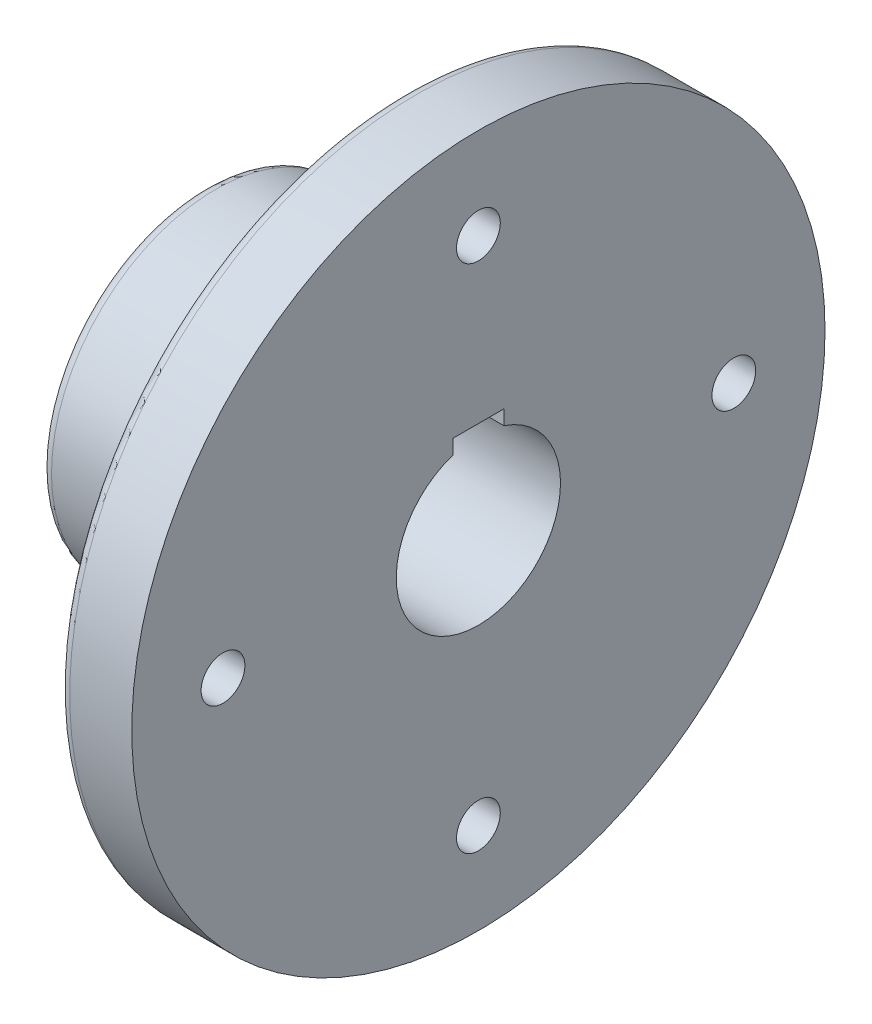
ISO-10303-21;
HEADER;
FILE_DESCRIPTION(('STEP AP214'),'2;1');
FILE_NAME('part.step','',(''),(''),'','','');
FILE_SCHEMA(('AUTOMOTIVE_DESIGN { 1 0 10303 214 1 1 1 1 }'));
ENDSEC;
DATA;
#1=APPLICATION_CONTEXT('core data for automotive mechanical design processes');
#2=APPLICATION_PROTOCOL_DEFINITION('international standard','automotive_design',2000,#1);
#3=PRODUCT_CONTEXT('',#1,'mechanical');
#4=PRODUCT('Part','Part','',(#3));
#5=PRODUCT_RELATED_PRODUCT_CATEGORY('part','',(#4));
#6=PRODUCT_DEFINITION_FORMATION('','',#4);
#7=PRODUCT_DEFINITION_CONTEXT('part definition',#1,'design');
#8=PRODUCT_DEFINITION('design','',#6,#7);
#9=PRODUCT_DEFINITION_SHAPE('','',#8);
#10=(LENGTH_UNIT() NAMED_UNIT(*) SI_UNIT(.MILLI.,.METRE.));
#11=(NAMED_UNIT(*) PLANE_ANGLE_UNIT() SI_UNIT($,.RADIAN.));
#12=(NAMED_UNIT(*) SI_UNIT($,.STERADIAN.) SOLID_ANGLE_UNIT());
#13=UNCERTAINTY_MEASURE_WITH_UNIT(LENGTH_MEASURE(1.E-05),#10,'distance_accuracy_value','');
#14=(GEOMETRIC_REPRESENTATION_CONTEXT(3) GLOBAL_UNCERTAINTY_ASSIGNED_CONTEXT((#13)) GLOBAL_UNIT_ASSIGNED_CONTEXT((#10,
#11,#12)) REPRESENTATION_CONTEXT('',''));
#15=CARTESIAN_POINT('',(0.,0.,0.));
#16=DIRECTION('',(0.,0.,1.));
#17=DIRECTION('',(1.,0.,0.));
#18=AXIS2_PLACEMENT_3D('',#15,#16,#17);
#19=CARTESIAN_POINT('',(-20.,0.,0.));
#20=DIRECTION('',(1.,0.,0.));
#21=DIRECTION('',(0.,0.,-1.));
#22=AXIS2_PLACEMENT_3D('',#19,#20,#21);
#23=CYLINDRICAL_SURFACE('',#22,95.);
#24=CARTESIAN_POINT('',(-17.,0.,0.));
#25=DIRECTION('',(1.,0.,0.));
#26=DIRECTION('',(0.,0.,-1.));
#27=AXIS2_PLACEMENT_3D('',#24,#25,#26);
#28=CIRCLE('',#27,95.);
#29=CARTESIAN_POINT('',(-17.,0.,-95.));
#30=VERTEX_POINT('',#29);
#31=EDGE_CURVE('E11',#30,#30,#28,.T.);
#32=ORIENTED_EDGE('',*,*,#31,.T.);
#33=EDGE_LOOP('',(#32));
#34=FACE_BOUND('',#33,.T.);
#35=CARTESIAN_POINT('',(0.,0.,0.));
#36=DIRECTION('',(1.,0.,0.));
#37=DIRECTION('',(0.,0.,-1.));
#38=AXIS2_PLACEMENT_3D('',#35,#36,#37);
#39=CIRCLE('',#38,95.);
#40=CARTESIAN_POINT('',(0.,0.,-95.));
#41=VERTEX_POINT('',#40);
#42=EDGE_CURVE('E167',#41,#41,#39,.T.);
#43=ORIENTED_EDGE('',*,*,#42,.F.);
#44=EDGE_LOOP('',(#43));
#45=FACE_BOUND('',#44,.T.);
#46=ADVANCED_FACE('F45',(#34,#45),#23,.T.);
#47=CARTESIAN_POINT('',(-20.,0.,0.));
#48=DIRECTION('',(1.,0.,0.));
#49=DIRECTION('',(0.,0.,-1.));
#50=AXIS2_PLACEMENT_3D('',#47,#48,#49);
#51=PLANE('',#50);
#52=CARTESIAN_POINT('',(-20.,0.,0.));
#53=DIRECTION('',(1.,0.,0.));
#54=DIRECTION('',(0.,0.,-1.));
#55=AXIS2_PLACEMENT_3D('',#52,#53,#54);
#56=CIRCLE('',#55,48.);
#57=CARTESIAN_POINT('',(-20.,0.,-48.));
#58=VERTEX_POINT('',#57);
#59=EDGE_CURVE('E54',#58,#58,#56,.T.);
#60=ORIENTED_EDGE('',*,*,#59,.T.);
#61=EDGE_LOOP('',(#60));
#62=FACE_BOUND('',#61,.T.);
#63=CARTESIAN_POINT('',(-20.,0.,0.));
#64=DIRECTION('',(1.,0.,0.));
#65=DIRECTION('',(0.,0.,-1.));
#66=AXIS2_PLACEMENT_3D('',#63,#64,#65);
#67=CIRCLE('',#66,92.);
#68=CARTESIAN_POINT('',(-20.,0.,-92.));
#69=VERTEX_POINT('',#68);
#70=EDGE_CURVE('E183',#69,#69,#67,.F.);
#71=ORIENTED_EDGE('',*,*,#70,.T.);
#72=EDGE_LOOP('',(#71));
#73=FACE_BOUND('',#72,.T.);
#74=CARTESIAN_POINT('',(-20.,70.,0.));
#75=DIRECTION('',(1.,0.,0.));
#76=DIRECTION('',(0.,0.,-1.));
#77=AXIS2_PLACEMENT_3D('',#74,#75,#76);
#78=CIRCLE('',#77,6.);
#79=CARTESIAN_POINT('',(-20.,70.,-6.));
#80=VERTEX_POINT('',#79);
#81=EDGE_CURVE('E133',#80,#80,#78,.F.);
#82=ORIENTED_EDGE('',*,*,#81,.F.);
#83=EDGE_LOOP('',(#82));
#84=FACE_BOUND('',#83,.T.);
#85=CARTESIAN_POINT('',(-20.,-2.44403693719019E-13,-70.));
#86=DIRECTION('',(1.,0.,0.));
#87=DIRECTION('',(0.,0.,-1.));
#88=AXIS2_PLACEMENT_3D('',#85,#86,#87);
#89=CIRCLE('',#88,6.00000000000001);
#90=CARTESIAN_POINT('',(-20.,-2.44403693719019E-13,-76.));
#91=VERTEX_POINT('',#90);
#92=EDGE_CURVE('E139',#91,#91,#89,.F.);
#93=ORIENTED_EDGE('',*,*,#92,.F.);
#94=EDGE_LOOP('',(#93));
#95=FACE_BOUND('',#94,.T.);
#96=CARTESIAN_POINT('',(-20.,-70.,4.88807387438039E-13));
#97=DIRECTION('',(1.,0.,0.));
#98=DIRECTION('',(0.,0.,-1.));
#99=AXIS2_PLACEMENT_3D('',#96,#97,#98);
#100=CIRCLE('',#99,6.);
#101=CARTESIAN_POINT('',(-20.,-70.,-5.99999999999951));
#102=VERTEX_POINT('',#101);
#103=EDGE_CURVE('E147',#102,#102,#100,.F.);
#104=ORIENTED_EDGE('',*,*,#103,.F.);
#105=EDGE_LOOP('',(#104));
#106=FACE_BOUND('',#105,.T.);
#107=CARTESIAN_POINT('',(-20.,7.33211081157058E-13,70.));
#108=DIRECTION('',(1.,0.,0.));
#109=DIRECTION('',(0.,0.,-1.));
#110=AXIS2_PLACEMENT_3D('',#107,#108,#109);
#111=CIRCLE('',#110,6.00000000000001);
#112=CARTESIAN_POINT('',(-20.,7.33211081157058E-13,64.));
#113=VERTEX_POINT('',#112);
#114=EDGE_CURVE('E124',#113,#113,#111,.F.);
#115=ORIENTED_EDGE('',*,*,#114,.F.);
#116=EDGE_LOOP('',(#115));
#117=FACE_BOUND('',#116,.T.);
#118=ADVANCED_FACE('F190',(#62,#73,#84,#95,#106,#117),#51,.F.);
#119=CARTESIAN_POINT('',(0.,0.,0.));
#120=DIRECTION('',(1.,0.,0.));
#121=DIRECTION('',(0.,0.,-1.));
#122=AXIS2_PLACEMENT_3D('',#119,#120,#121);
#123=PLANE('',#122);
#124=DIRECTION('',(0.,1.,0.));
#125=VECTOR('',#124,1.);
#126=CARTESIAN_POINT('',(0.,25.3834047803431,-7.));
#127=LINE('',#126,#125);
#128=CARTESIAN_POINT('',(0.,21.3834047803431,-7.));
#129=VERTEX_POINT('',#128);
#130=CARTESIAN_POINT('',(0.,25.3834047803431,-7.));
#131=VERTEX_POINT('',#130);
#132=EDGE_CURVE('E115',#129,#131,#127,.T.);
#133=ORIENTED_EDGE('',*,*,#132,.F.);
#134=CARTESIAN_POINT('',(0.,0.,0.));
#135=DIRECTION('',(1.,0.,0.));
#136=DIRECTION('',(0.,0.,-1.));
#137=AXIS2_PLACEMENT_3D('',#134,#135,#136);
#138=CIRCLE('',#137,22.5);
#139=CARTESIAN_POINT('',(0.,21.3834047803431,6.99999999999999));
#140=VERTEX_POINT('',#139);
#141=EDGE_CURVE('E138',#140,#129,#138,.T.);
#142=ORIENTED_EDGE('',*,*,#141,.F.);
#143=DIRECTION('',(0.,-1.,0.));
#144=VECTOR('',#143,1.);
#145=CARTESIAN_POINT('',(0.,25.3834047803431,7.));
#146=LINE('',#145,#144);
#147=CARTESIAN_POINT('',(0.,25.3834047803431,7.));
#148=VERTEX_POINT('',#147);
#149=EDGE_CURVE('E61',#148,#140,#146,.T.);
#150=ORIENTED_EDGE('',*,*,#149,.F.);
#151=DIRECTION('',(0.,0.,1.));
#152=VECTOR('',#151,1.);
#153=CARTESIAN_POINT('',(0.,25.3834047803431,7.));
#154=LINE('',#153,#152);
#155=EDGE_CURVE('E97',#131,#148,#154,.T.);
#156=ORIENTED_EDGE('',*,*,#155,.F.);
#157=EDGE_LOOP('',(#133,#142,#150,#156));
#158=FACE_BOUND('',#157,.T.);
#159=CARTESIAN_POINT('',(0.,70.,0.));
#160=DIRECTION('',(1.,0.,0.));
#161=DIRECTION('',(0.,0.,-1.));
#162=AXIS2_PLACEMENT_3D('',#159,#160,#161);
#163=CIRCLE('',#162,6.);
#164=CARTESIAN_POINT('',(0.,70.,-6.));
#165=VERTEX_POINT('',#164);
#166=EDGE_CURVE('E129',#165,#165,#163,.T.);
#167=ORIENTED_EDGE('',*,*,#166,.F.);
#168=EDGE_LOOP('',(#167));
#169=FACE_BOUND('',#168,.T.);
#170=CARTESIAN_POINT('',(0.,-2.44403693719019E-13,-70.));
#171=DIRECTION('',(1.,0.,0.));
#172=DIRECTION('',(0.,0.,-1.));
#173=AXIS2_PLACEMENT_3D('',#170,#171,#172);
#174=CIRCLE('',#173,6.00000000000001);
#175=CARTESIAN_POINT('',(0.,-2.44403693719019E-13,-76.));
#176=VERTEX_POINT('',#175);
#177=EDGE_CURVE('E134',#176,#176,#174,.T.);
#178=ORIENTED_EDGE('',*,*,#177,.F.);
#179=EDGE_LOOP('',(#178));
#180=FACE_BOUND('',#179,.T.);
#181=CARTESIAN_POINT('',(0.,-70.,4.88807387438039E-13));
#182=DIRECTION('',(1.,0.,0.));
#183=DIRECTION('',(0.,0.,-1.));
#184=AXIS2_PLACEMENT_3D('',#181,#182,#183);
#185=CIRCLE('',#184,6.);
#186=CARTESIAN_POINT('',(0.,-70.,-5.99999999999951));
#187=VERTEX_POINT('',#186);
#188=EDGE_CURVE('E143',#187,#187,#185,.T.);
#189=ORIENTED_EDGE('',*,*,#188,.F.);
#190=EDGE_LOOP('',(#189));
#191=FACE_BOUND('',#190,.T.);
#192=CARTESIAN_POINT('',(0.,7.33211081157058E-13,70.));
#193=DIRECTION('',(1.,0.,0.));
#194=DIRECTION('',(0.,0.,-1.));
#195=AXIS2_PLACEMENT_3D('',#192,#193,#194);
#196=CIRCLE('',#195,6.00000000000001);
#197=CARTESIAN_POINT('',(0.,7.33211081157058E-13,64.));
#198=VERTEX_POINT('',#197);
#199=EDGE_CURVE('E151',#198,#198,#196,.T.);
#200=ORIENTED_EDGE('',*,*,#199,.F.);
#201=EDGE_LOOP('',(#200));
#202=FACE_BOUND('',#201,.T.);
#203=ORIENTED_EDGE('',*,*,#42,.T.);
#204=EDGE_LOOP('',(#203));
#205=FACE_BOUND('',#204,.T.);
#206=ADVANCED_FACE('F201',(#158,#169,#180,#191,#202,#205),#123,.T.);
#207=CARTESIAN_POINT('',(-75.,0.,0.));
#208=DIRECTION('',(1.,0.,0.));
#209=DIRECTION('',(0.,0.,-1.));
#210=AXIS2_PLACEMENT_3D('',#207,#208,#209);
#211=CYLINDRICAL_SURFACE('',#210,45.);
#212=CARTESIAN_POINT('',(-72.,0.,0.));
#213=DIRECTION('',(-1.,0.,0.));
#214=DIRECTION('',(0.,0.,1.));
#215=AXIS2_PLACEMENT_3D('',#212,#213,#214);
#216=CIRCLE('',#215,45.);
#217=CARTESIAN_POINT('',(-72.,0.,45.));
#218=VERTEX_POINT('',#217);
#219=EDGE_CURVE('E179',#218,#218,#216,.F.);
#220=ORIENTED_EDGE('',*,*,#219,.T.);
#221=EDGE_LOOP('',(#220));
#222=FACE_BOUND('',#221,.T.);
#223=CARTESIAN_POINT('',(-23.,0.,0.));
#224=DIRECTION('',(1.,0.,0.));
#225=DIRECTION('',(0.,0.,-1.));
#226=AXIS2_PLACEMENT_3D('',#223,#224,#225);
#227=CIRCLE('',#226,45.);
#228=CARTESIAN_POINT('',(-23.,0.,-45.));
#229=VERTEX_POINT('',#228);
#230=EDGE_CURVE('E175',#229,#229,#227,.F.);
#231=ORIENTED_EDGE('',*,*,#230,.T.);
#232=EDGE_LOOP('',(#231));
#233=FACE_BOUND('',#232,.T.);
#234=ADVANCED_FACE('F199',(#222,#233),#211,.T.);
#235=CARTESIAN_POINT('',(-75.,0.,0.));
#236=DIRECTION('',(-1.,0.,0.));
#237=DIRECTION('',(0.,0.,1.));
#238=AXIS2_PLACEMENT_3D('',#235,#236,#237);
#239=PLANE('',#238);
#240=CARTESIAN_POINT('',(-75.,0.,0.));
#241=DIRECTION('',(-1.,0.,0.));
#242=DIRECTION('',(0.,0.,1.));
#243=AXIS2_PLACEMENT_3D('',#240,#241,#242);
#244=CIRCLE('',#243,42.);
#245=CARTESIAN_POINT('',(-75.,0.,42.));
#246=VERTEX_POINT('',#245);
#247=EDGE_CURVE('E171',#246,#246,#244,.T.);
#248=ORIENTED_EDGE('',*,*,#247,.T.);
#249=EDGE_LOOP('',(#248));
#250=FACE_BOUND('',#249,.T.);
#251=DIRECTION('',(0.,1.,0.));
#252=VECTOR('',#251,1.);
#253=CARTESIAN_POINT('',(-75.,25.3834047803431,-7.));
#254=LINE('',#253,#252);
#255=CARTESIAN_POINT('',(-75.,21.3834047803431,-7.));
#256=VERTEX_POINT('',#255);
#257=CARTESIAN_POINT('',(-75.,25.3834047803431,-7.));
#258=VERTEX_POINT('',#257);
#259=EDGE_CURVE('E70',#256,#258,#254,.T.);
#260=ORIENTED_EDGE('',*,*,#259,.T.);
#261=DIRECTION('',(0.,0.,1.));
#262=VECTOR('',#261,1.);
#263=CARTESIAN_POINT('',(-75.,25.3834047803431,7.));
#264=LINE('',#263,#262);
#265=CARTESIAN_POINT('',(-75.,25.3834047803431,7.));
#266=VERTEX_POINT('',#265);
#267=EDGE_CURVE('E95',#258,#266,#264,.T.);
#268=ORIENTED_EDGE('',*,*,#267,.T.);
#269=DIRECTION('',(0.,-1.,0.));
#270=VECTOR('',#269,1.);
#271=CARTESIAN_POINT('',(-75.,25.3834047803431,7.));
#272=LINE('',#271,#270);
#273=CARTESIAN_POINT('',(-75.,21.3834047803431,7.));
#274=VERTEX_POINT('',#273);
#275=EDGE_CURVE('E102',#266,#274,#272,.T.);
#276=ORIENTED_EDGE('',*,*,#275,.T.);
#277=CARTESIAN_POINT('',(-75.,0.,0.));
#278=DIRECTION('',(-1.,0.,0.));
#279=DIRECTION('',(0.,0.,1.));
#280=AXIS2_PLACEMENT_3D('',#277,#278,#279);
#281=CIRCLE('',#280,22.5);
#282=EDGE_CURVE('E164',#274,#256,#281,.F.);
#283=ORIENTED_EDGE('',*,*,#282,.T.);
#284=EDGE_LOOP('',(#260,#268,#276,#283));
#285=FACE_BOUND('',#284,.T.);
#286=ADVANCED_FACE('F109',(#250,#285),#239,.T.);
#287=CARTESIAN_POINT('',(-138.639610306789,0.,0.));
#288=DIRECTION('',(1.,0.,0.));
#289=DIRECTION('',(0.,0.,-1.));
#290=AXIS2_PLACEMENT_3D('',#287,#288,#289);
#291=CYLINDRICAL_SURFACE('',#290,22.5);
#292=ORIENTED_EDGE('',*,*,#141,.T.);
#293=DIRECTION('',(1.,0.,0.));
#294=VECTOR('',#293,1.);
#295=CARTESIAN_POINT('',(-75.,21.3834047803431,-7.));
#296=LINE('',#295,#294);
#297=EDGE_CURVE('E83',#256,#129,#296,.T.);
#298=ORIENTED_EDGE('',*,*,#297,.F.);
#299=ORIENTED_EDGE('',*,*,#282,.F.);
#300=DIRECTION('',(1.,0.,0.));
#301=VECTOR('',#300,1.);
#302=CARTESIAN_POINT('',(-75.,21.3834047803431,7.));
#303=LINE('',#302,#301);
#304=EDGE_CURVE('E99',#274,#140,#303,.T.);
#305=ORIENTED_EDGE('',*,*,#304,.T.);
#306=EDGE_LOOP('',(#292,#298,#299,#305));
#307=FACE_BOUND('',#306,.T.);
#308=ADVANCED_FACE('F208',(#307),#291,.F.);
#309=CARTESIAN_POINT('',(-36.9705627484772,7.33211081157058E-13,70.));
#310=DIRECTION('',(1.,0.,0.));
#311=DIRECTION('',(0.,0.,-1.));
#312=AXIS2_PLACEMENT_3D('',#309,#310,#311);
#313=CYLINDRICAL_SURFACE('',#312,6.00000000000001);
#314=ORIENTED_EDGE('',*,*,#114,.T.);
#315=EDGE_LOOP('',(#314));
#316=FACE_BOUND('',#315,.T.);
#317=ORIENTED_EDGE('',*,*,#199,.T.);
#318=EDGE_LOOP('',(#317));
#319=FACE_BOUND('',#318,.T.);
#320=ADVANCED_FACE('F250',(#316,#319),#313,.F.);
#321=CARTESIAN_POINT('',(-36.9705627484772,-70.,4.88807387438039E-13));
#322=DIRECTION('',(1.,0.,0.));
#323=DIRECTION('',(0.,0.,-1.));
#324=AXIS2_PLACEMENT_3D('',#321,#322,#323);
#325=CYLINDRICAL_SURFACE('',#324,6.);
#326=ORIENTED_EDGE('',*,*,#103,.T.);
#327=EDGE_LOOP('',(#326));
#328=FACE_BOUND('',#327,.T.);
#329=ORIENTED_EDGE('',*,*,#188,.T.);
#330=EDGE_LOOP('',(#329));
#331=FACE_BOUND('',#330,.T.);
#332=ADVANCED_FACE('F246',(#328,#331),#325,.F.);
#333=CARTESIAN_POINT('',(-36.9705627484772,-2.44403693719019E-13,-70.));
#334=DIRECTION('',(1.,0.,0.));
#335=DIRECTION('',(0.,0.,-1.));
#336=AXIS2_PLACEMENT_3D('',#333,#334,#335);
#337=CYLINDRICAL_SURFACE('',#336,6.00000000000001);
#338=ORIENTED_EDGE('',*,*,#92,.T.);
#339=EDGE_LOOP('',(#338));
#340=FACE_BOUND('',#339,.T.);
#341=ORIENTED_EDGE('',*,*,#177,.T.);
#342=EDGE_LOOP('',(#341));
#343=FACE_BOUND('',#342,.T.);
#344=ADVANCED_FACE('F242',(#340,#343),#337,.F.);
#345=CARTESIAN_POINT('',(-36.9705627484772,70.,0.));
#346=DIRECTION('',(1.,0.,0.));
#347=DIRECTION('',(0.,0.,-1.));
#348=AXIS2_PLACEMENT_3D('',#345,#346,#347);
#349=CYLINDRICAL_SURFACE('',#348,6.);
#350=ORIENTED_EDGE('',*,*,#81,.T.);
#351=EDGE_LOOP('',(#350));
#352=FACE_BOUND('',#351,.T.);
#353=ORIENTED_EDGE('',*,*,#166,.T.);
#354=EDGE_LOOP('',(#353));
#355=FACE_BOUND('',#354,.T.);
#356=ADVANCED_FACE('F239',(#352,#355),#349,.F.);
#357=CARTESIAN_POINT('',(-75.,25.3834047803431,-7.));
#358=DIRECTION('',(0.,0.,-1.));
#359=DIRECTION('',(0.,1.,0.));
#360=AXIS2_PLACEMENT_3D('',#357,#358,#359);
#361=PLANE('',#360);
#362=ORIENTED_EDGE('',*,*,#132,.T.);
#363=DIRECTION('',(1.,0.,0.));
#364=VECTOR('',#363,1.);
#365=CARTESIAN_POINT('',(-75.,25.3834047803431,-7.));
#366=LINE('',#365,#364);
#367=EDGE_CURVE('E86',#258,#131,#366,.T.);
#368=ORIENTED_EDGE('',*,*,#367,.F.);
#369=ORIENTED_EDGE('',*,*,#259,.F.);
#370=ORIENTED_EDGE('',*,*,#297,.T.);
#371=EDGE_LOOP('',(#362,#368,#369,#370));
#372=FACE_BOUND('',#371,.T.);
#373=ADVANCED_FACE('F234',(#372),#361,.F.);
#374=CARTESIAN_POINT('',(-75.,25.3834047803431,7.));
#375=DIRECTION('',(0.,0.,1.));
#376=DIRECTION('',(0.,-1.,0.));
#377=AXIS2_PLACEMENT_3D('',#374,#375,#376);
#378=PLANE('',#377);
#379=ORIENTED_EDGE('',*,*,#149,.T.);
#380=ORIENTED_EDGE('',*,*,#304,.F.);
#381=ORIENTED_EDGE('',*,*,#275,.F.);
#382=DIRECTION('',(1.,0.,0.));
#383=VECTOR('',#382,1.);
#384=CARTESIAN_POINT('',(-75.,25.3834047803431,7.));
#385=LINE('',#384,#383);
#386=EDGE_CURVE('E91',#266,#148,#385,.T.);
#387=ORIENTED_EDGE('',*,*,#386,.T.);
#388=EDGE_LOOP('',(#379,#380,#381,#387));
#389=FACE_BOUND('',#388,.T.);
#390=ADVANCED_FACE('F103',(#389),#378,.F.);
#391=CARTESIAN_POINT('',(-75.,25.3834047803431,7.));
#392=DIRECTION('',(0.,1.,0.));
#393=DIRECTION('',(0.,0.,1.));
#394=AXIS2_PLACEMENT_3D('',#391,#392,#393);
#395=PLANE('',#394);
#396=ORIENTED_EDGE('',*,*,#155,.T.);
#397=ORIENTED_EDGE('',*,*,#386,.F.);
#398=ORIENTED_EDGE('',*,*,#267,.F.);
#399=ORIENTED_EDGE('',*,*,#367,.T.);
#400=EDGE_LOOP('',(#396,#397,#398,#399));
#401=FACE_BOUND('',#400,.T.);
#402=ADVANCED_FACE('F93',(#401),#395,.F.);
#403=CARTESIAN_POINT('',(-72.,0.,0.));
#404=DIRECTION('',(-1.,0.,0.));
#405=DIRECTION('',(0.,0.,1.));
#406=AXIS2_PLACEMENT_3D('',#403,#404,#405);
#407=TOROIDAL_SURFACE('',#406,42.,3.);
#408=ORIENTED_EDGE('',*,*,#219,.F.);
#409=EDGE_LOOP('',(#408));
#410=FACE_BOUND('',#409,.T.);
#411=ORIENTED_EDGE('',*,*,#247,.F.);
#412=EDGE_LOOP('',(#411));
#413=FACE_BOUND('',#412,.T.);
#414=ADVANCED_FACE('F196',(#410,#413),#407,.T.);
#415=CARTESIAN_POINT('',(-23.,0.,0.));
#416=DIRECTION('',(1.,0.,0.));
#417=DIRECTION('',(0.,0.,-1.));
#418=AXIS2_PLACEMENT_3D('',#415,#416,#417);
#419=TOROIDAL_SURFACE('',#418,48.,3.);
#420=ORIENTED_EDGE('',*,*,#59,.F.);
#421=EDGE_LOOP('',(#420));
#422=FACE_BOUND('',#421,.T.);
#423=ORIENTED_EDGE('',*,*,#230,.F.);
#424=EDGE_LOOP('',(#423));
#425=FACE_BOUND('',#424,.T.);
#426=ADVANCED_FACE('F193',(#422,#425),#419,.F.);
#427=CARTESIAN_POINT('',(-17.,0.,0.));
#428=DIRECTION('',(1.,0.,0.));
#429=DIRECTION('',(0.,0.,-1.));
#430=AXIS2_PLACEMENT_3D('',#427,#428,#429);
#431=TOROIDAL_SURFACE('',#430,92.,3.);
#432=ORIENTED_EDGE('',*,*,#70,.F.);
#433=EDGE_LOOP('',(#432));
#434=FACE_BOUND('',#433,.T.);
#435=ORIENTED_EDGE('',*,*,#31,.F.);
#436=EDGE_LOOP('',(#435));
#437=FACE_BOUND('',#436,.T.);
#438=ADVANCED_FACE('F47',(#434,#437),#431,.T.);
#439=CLOSED_SHELL('',(#46,#118,#206,#234,#286,#308,#320,#332,#344,#356,#373,#390,#402,#414,#426,#438));
#440=MANIFOLD_SOLID_BREP('B2',#439);
#441=ADVANCED_BREP_SHAPE_REPRESENTATION('',(#18,#440),#14);
#442=SHAPE_DEFINITION_REPRESENTATION(#9,#441);
ENDSEC;
END-ISO-10303-21;
